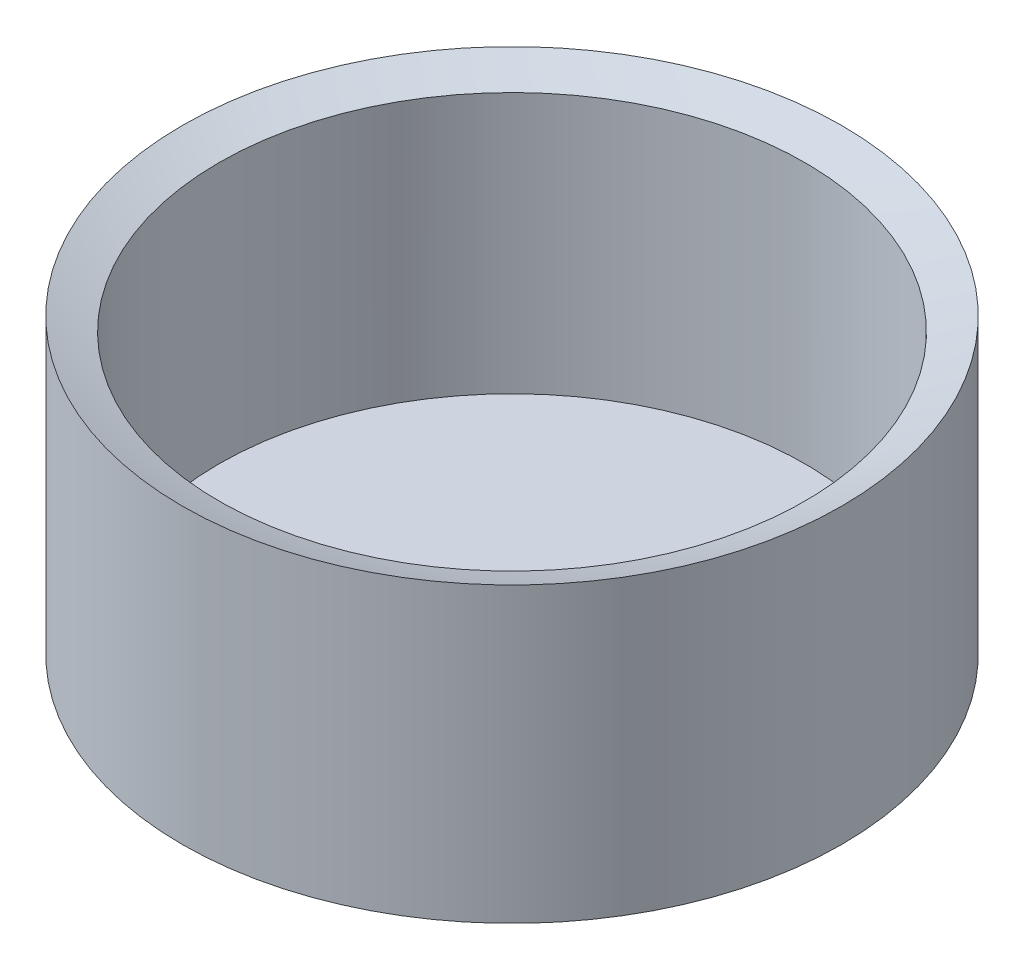
ISO-10303-21;
HEADER;
FILE_DESCRIPTION(('STEP AP214'),'2;1');
FILE_NAME('part.step','',(''),(''),'','','');
FILE_SCHEMA(('AUTOMOTIVE_DESIGN { 1 0 10303 214 1 1 1 1 }'));
ENDSEC;
DATA;
#1=APPLICATION_CONTEXT('core data for automotive mechanical design processes');
#2=APPLICATION_PROTOCOL_DEFINITION('international standard','automotive_design',2000,#1);
#3=PRODUCT_CONTEXT('',#1,'mechanical');
#4=PRODUCT('Part','Part','',(#3));
#5=PRODUCT_RELATED_PRODUCT_CATEGORY('part','',(#4));
#6=PRODUCT_DEFINITION_FORMATION('','',#4);
#7=PRODUCT_DEFINITION_CONTEXT('part definition',#1,'design');
#8=PRODUCT_DEFINITION('design','',#6,#7);
#9=PRODUCT_DEFINITION_SHAPE('','',#8);
#10=(LENGTH_UNIT() NAMED_UNIT(*) SI_UNIT(.MILLI.,.METRE.));
#11=(NAMED_UNIT(*) PLANE_ANGLE_UNIT() SI_UNIT($,.RADIAN.));
#12=(NAMED_UNIT(*) SI_UNIT($,.STERADIAN.) SOLID_ANGLE_UNIT());
#13=UNCERTAINTY_MEASURE_WITH_UNIT(LENGTH_MEASURE(1.E-05),#10,'distance_accuracy_value','');
#14=(GEOMETRIC_REPRESENTATION_CONTEXT(3) GLOBAL_UNCERTAINTY_ASSIGNED_CONTEXT((#13)) GLOBAL_UNIT_ASSIGNED_CONTEXT((#10,
#11,#12)) REPRESENTATION_CONTEXT('',''));
#15=CARTESIAN_POINT('',(0.,0.,0.));
#16=DIRECTION('',(0.,0.,1.));
#17=DIRECTION('',(1.,0.,0.));
#18=AXIS2_PLACEMENT_3D('',#15,#16,#17);
#19=CARTESIAN_POINT('',(-50.8,50.8,0.));
#20=DIRECTION('',(0.,1.,0.));
#21=DIRECTION('',(-1.,0.,0.));
#22=AXIS2_PLACEMENT_3D('',#19,#20,#21);
#23=CYLINDRICAL_SURFACE('',#22,50.8);
#24=CARTESIAN_POINT('',(-50.8,3.175,0.));
#25=DIRECTION('',(0.,1.,0.));
#26=DIRECTION('',(0.,0.,1.));
#27=AXIS2_PLACEMENT_3D('',#24,#25,#26);
#28=CIRCLE('',#27,50.8);
#29=CARTESIAN_POINT('',(-50.8,3.175,50.8));
#30=VERTEX_POINT('',#29);
#31=EDGE_CURVE('E44',#30,#30,#28,.F.);
#32=ORIENTED_EDGE('',*,*,#31,.T.);
#33=EDGE_LOOP('',(#32));
#34=FACE_BOUND('',#33,.T.);
#35=CARTESIAN_POINT('',(-50.8,48.3944832420659,0.));
#36=DIRECTION('',(0.,1.,0.));
#37=DIRECTION('',(-1.,0.,0.));
#38=AXIS2_PLACEMENT_3D('',#35,#36,#37);
#39=CIRCLE('',#38,50.8);
#40=CARTESIAN_POINT('',(-101.6,48.3944832420659,0.));
#41=VERTEX_POINT('',#40);
#42=EDGE_CURVE('E49',#41,#41,#39,.F.);
#43=ORIENTED_EDGE('',*,*,#42,.F.);
#44=EDGE_LOOP('',(#43));
#45=FACE_BOUND('',#44,.T.);
#46=ADVANCED_FACE('F37',(#34,#45),#23,.F.);
#47=CARTESIAN_POINT('',(-50.8,3.175,0.));
#48=DIRECTION('',(0.,1.,0.));
#49=DIRECTION('',(0.,0.,1.));
#50=AXIS2_PLACEMENT_3D('',#47,#48,#49);
#51=PLANE('',#50);
#52=ORIENTED_EDGE('',*,*,#31,.F.);
#53=EDGE_LOOP('',(#52));
#54=FACE_BOUND('',#53,.T.);
#55=ADVANCED_FACE('F67',(#54),#51,.T.);
#56=CARTESIAN_POINT('',(-50.8,192.078581179172,0.));
#57=DIRECTION('',(0.,-1.,0.));
#58=DIRECTION('',(-1.,0.,0.));
#59=AXIS2_PLACEMENT_3D('',#56,#57,#58);
#60=SPHERICAL_SURFACE('',#59,152.4);
#61=CARTESIAN_POINT('',(-50.8,50.8,0.));
#62=DIRECTION('',(0.,-1.,0.));
#63=DIRECTION('',(0.,0.,-1.));
#64=AXIS2_PLACEMENT_3D('',#61,#62,#63);
#65=CIRCLE('',#64,57.15);
#66=CARTESIAN_POINT('',(-107.95,50.8,0.));
#67=VERTEX_POINT('',#66);
#68=EDGE_CURVE('E54',#67,#67,#65,.T.);
#69=CARTESIAN_POINT('',(-107.95,50.8,0.));
#70=CARTESIAN_POINT('',(-107.884423390527,50.7734729553107,0.));
#71=CARTESIAN_POINT('',(-107.818828311631,50.7469915682599,0.));
#72=CARTESIAN_POINT('',(-107.687601342237,50.6941201606442,0.));
#73=CARTESIAN_POINT('',(-107.62196945174,50.6677301400794,0.));
#74=CARTESIAN_POINT('',(-107.490668986395,50.6150415166445,0.));
#75=CARTESIAN_POINT('',(-107.425000411546,50.5887429137745,0.));
#76=CARTESIAN_POINT('',(-107.293626704834,50.5362371767133,0.));
#77=CARTESIAN_POINT('',(-107.227921572972,50.5100300425222,0.));
#78=CARTESIAN_POINT('',(-107.096474879637,50.4577072936384,0.));
#79=CARTESIAN_POINT('',(-107.030733318164,50.4315916789457,0.));
#80=CARTESIAN_POINT('',(-106.899213893086,50.3794520196973,0.));
#81=CARTESIAN_POINT('',(-106.83343602948,50.3534279751416,0.));
#82=CARTESIAN_POINT('',(-106.701844127681,50.3014715066292,0.));
#83=CARTESIAN_POINT('',(-106.636030089487,50.2755390826725,0.));
#84=CARTESIAN_POINT('',(-106.504365966129,50.2237659056422,0.));
#85=CARTESIAN_POINT('',(-106.438515880964,50.1979251525685,0.));
#86=CARTESIAN_POINT('',(-106.30677979135,50.1463353674106,0.));
#87=CARTESIAN_POINT('',(-106.240893786901,50.1205863353264,0.));
#88=CARTESIAN_POINT('',(-106.109085986473,50.0691800420758,0.));
#89=CARTESIAN_POINT('',(-106.043164190494,50.0435227809095,0.));
#90=CARTESIAN_POINT('',(-105.911284934833,49.9923000792454,0.));
#91=CARTESIAN_POINT('',(-105.845327475151,49.9667346387476,0.));
#92=CARTESIAN_POINT('',(-105.713377019977,49.915695627993,0.));
#93=CARTESIAN_POINT('',(-105.647384024485,49.8902220577362,0.));
#94=CARTESIAN_POINT('',(-105.515362625655,49.839366836858,0.));
#95=CARTESIAN_POINT('',(-105.449334222318,49.8139851862366,0.));
#96=CARTESIAN_POINT('',(-105.317242135828,49.7633138538453,0.));
#97=CARTESIAN_POINT('',(-105.251178452676,49.7380241720754,0.));
#98=CARTESIAN_POINT('',(-105.119015934659,49.687536826425,0.));
#99=CARTESIAN_POINT('',(-105.052917099794,49.6623391625445,0.));
#100=CARTESIAN_POINT('',(-104.920684406518,49.6120359015321,0.));
#101=CARTESIAN_POINT('',(-104.854550548107,49.5869303044003,0.));
#102=CARTESIAN_POINT('',(-104.722247935978,49.5368112255663,0.));
#103=CARTESIAN_POINT('',(-104.656079182259,49.5117977438641,0.));
#104=CARTESIAN_POINT('',(-104.523706907816,49.4618629443915,0.));
#105=CARTESIAN_POINT('',(-104.457503387093,49.4369416266211,0.));
#106=CARTESIAN_POINT('',(-104.325061707013,49.3871912033357,0.));
#107=CARTESIAN_POINT('',(-104.258823547656,49.3623620978207,0.));
#108=CARTESIAN_POINT('',(-104.126312718749,49.3127961471908,0.));
#109=CARTESIAN_POINT('',(-104.060040049199,49.2880593020759,0.));
#110=CARTESIAN_POINT('',(-103.927460328409,49.2386779202121,0.));
#111=CARTESIAN_POINT('',(-103.86115327717,49.2140333834631,0.));
#112=CARTESIAN_POINT('',(-103.728504921575,49.164836666118,0.));
#113=CARTESIAN_POINT('',(-103.66216361722,49.1402844855218,0.));
#114=CARTESIAN_POINT('',(-103.529446884032,49.09127252809,0.));
#115=CARTESIAN_POINT('',(-103.463071455199,49.0668127512544,0.));
#116=CARTESIAN_POINT('',(-103.33028660176,49.0179856487723,0.));
#117=CARTESIAN_POINT('',(-103.263877177155,48.9936183231258,0.));
#118=CARTESIAN_POINT('',(-103.131024460942,48.9449761702713,0.));
#119=CARTESIAN_POINT('',(-103.064581169335,48.9207013430633,0.));
#120=CARTESIAN_POINT('',(-102.931660847954,48.8722442341556,0.));
#121=CARTESIAN_POINT('',(-102.865183818182,48.848061952456,0.));
#122=CARTESIAN_POINT('',(-102.732196149373,48.7997899814558,0.));
#123=CARTESIAN_POINT('',(-102.665685510337,48.7757002921552,0.));
#124=CARTESIAN_POINT('',(-102.532630751968,48.7276135526636,0.));
#125=CARTESIAN_POINT('',(-102.466086632636,48.7036165024728,0.));
#126=CARTESIAN_POINT('',(-102.332965042706,48.6557150877328,0.));
#127=CARTESIAN_POINT('',(-102.266387572109,48.6318107231838,0.));
#128=CARTESIAN_POINT('',(-102.133199408748,48.5840947260764,0.));
#129=CARTESIAN_POINT('',(-102.066588715984,48.5602830935181,0.));
#130=CARTESIAN_POINT('',(-101.933334237446,48.5127526065741,0.));
#131=CARTESIAN_POINT('',(-101.866690451673,48.4890337521885,0.));
#132=CARTESIAN_POINT('',(-101.733369916355,48.4416888675438,0.));
#133=CARTESIAN_POINT('',(-101.66669316681,48.4180628372847,0.));
#134=CARTESIAN_POINT('',(-101.6,48.3944832420659,0.));
#135=B_SPLINE_CURVE_WITH_KNOTS('',3,(#69,#70,#71,#72,#73,#74,#75,#76,#77,#78,#79,#80,#81,#82,
#83,#84,#85,#86,#87,#88,#89,#90,#91,#92,#93,#94,#95,#96,#97,#98,#99,#100,#101,#102,#103,#104,
#105,#106,#107,#108,#109,#110,#111,#112,#113,#114,#115,#116,#117,#118,#119,#120,#121,#122,#123,
#124,#125,#126,#127,#128,#129,#130,#131,#132,#133,#134),.UNSPECIFIED.,.F.,.F.,(4,2,2,2,2,2,2,2,
2,2,2,2,2,2,2,2,2,2,2,2,2,2,2,2,2,2,2,2,2,2,2,2,4),(0.,0.212216340114534,0.424432680229038,
0.636649020343573,0.848865360458074,1.06108170057261,1.27329804068711,1.48551438080166,
1.69773072091615,1.90994706103068,2.12216340114522,2.33437974125971,2.54659608137426,
2.75881242148877,2.97102876160329,3.18324510171781,3.39546144183233,3.60767778194687,
3.81989412206137,4.03211046217591,4.24432680229041,4.45654314240494,4.66875948251945,
4.88097582263399,5.09319216274853,5.30540850286302,5.51762484297756,5.72984118309206,
5.94205752320659,6.1542738633211,6.36649020343563,6.57870654355014,6.79092288366467),.UNSPECIFIED.);
#136=EDGE_CURVE('BSEAM63',#67,#41,#135,.T.);
#137=ORIENTED_EDGE('',*,*,#68,.F.);
#138=ORIENTED_EDGE('',*,*,#42,.T.);
#139=ORIENTED_EDGE('',*,*,#136,.T.);
#140=ORIENTED_EDGE('',*,*,#136,.F.);
#141=EDGE_LOOP('',(#137,#139,#138,#140));
#142=FACE_BOUND('',#141,.T.);
#143=ADVANCED_FACE('F63',(#142),#60,.F.);
#144=CARTESIAN_POINT('',(0.,0.,0.));
#145=DIRECTION('',(0.,1.,0.));
#146=DIRECTION('',(-1.,0.,0.));
#147=AXIS2_PLACEMENT_3D('',#144,#145,#146);
#148=PLANE('',#147);
#149=CARTESIAN_POINT('',(-50.8,0.,0.));
#150=DIRECTION('',(0.,1.,0.));
#151=DIRECTION('',(-1.,0.,0.));
#152=AXIS2_PLACEMENT_3D('',#149,#150,#151);
#153=CIRCLE('',#152,57.15);
#154=CARTESIAN_POINT('',(-107.95,0.,0.));
#155=VERTEX_POINT('',#154);
#156=EDGE_CURVE('E10',#155,#155,#153,.T.);
#157=ORIENTED_EDGE('',*,*,#156,.F.);
#158=EDGE_LOOP('',(#157));
#159=FACE_BOUND('',#158,.T.);
#160=ADVANCED_FACE('F66',(#159),#148,.F.);
#161=CARTESIAN_POINT('',(-50.8,50.8,0.));
#162=DIRECTION('',(0.,1.,0.));
#163=DIRECTION('',(-1.,0.,0.));
#164=AXIS2_PLACEMENT_3D('',#161,#162,#163);
#165=CYLINDRICAL_SURFACE('',#164,57.15);
#166=ORIENTED_EDGE('',*,*,#68,.T.);
#167=EDGE_LOOP('',(#166));
#168=FACE_BOUND('',#167,.T.);
#169=ORIENTED_EDGE('',*,*,#156,.T.);
#170=EDGE_LOOP('',(#169));
#171=FACE_BOUND('',#170,.T.);
#172=ADVANCED_FACE('F61',(#168,#171),#165,.T.);
#173=CLOSED_SHELL('',(#46,#55,#143,#160,#172));
#174=MANIFOLD_SOLID_BREP('B2',#173);
#175=ADVANCED_BREP_SHAPE_REPRESENTATION('',(#18,#174),#14);
#176=SHAPE_DEFINITION_REPRESENTATION(#9,#175);
ENDSEC;
END-ISO-10303-21;
